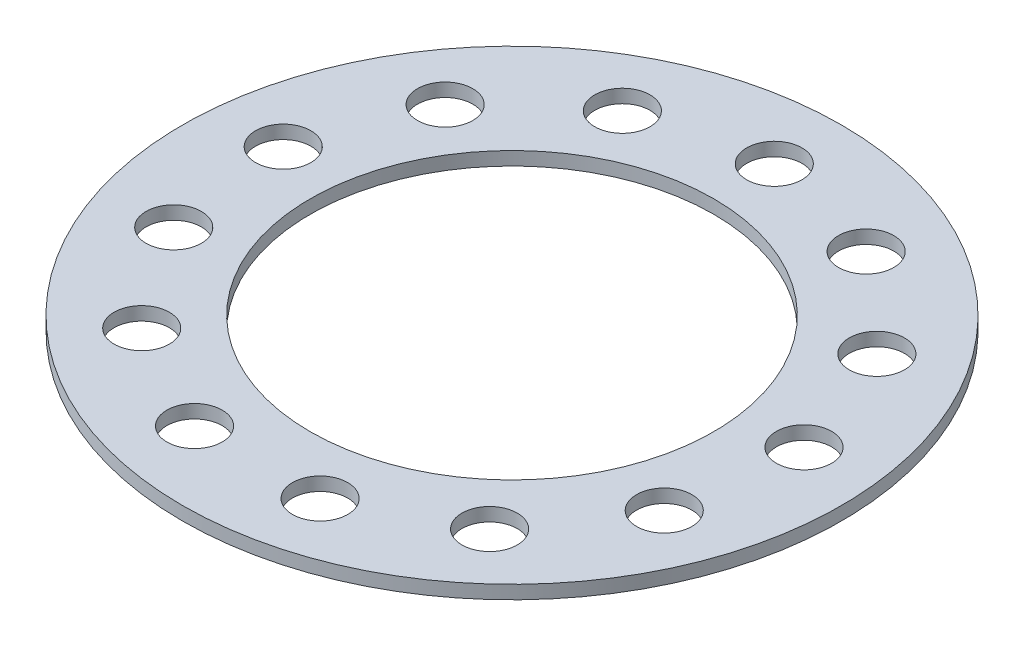
ISO-10303-21;
HEADER;
FILE_DESCRIPTION(('STEP AP214'),'2;1');
FILE_NAME('part.step','',(''),(''),'','','');
FILE_SCHEMA(('AUTOMOTIVE_DESIGN { 1 0 10303 214 1 1 1 1 }'));
ENDSEC;
DATA;
#1=APPLICATION_CONTEXT('core data for automotive mechanical design processes');
#2=APPLICATION_PROTOCOL_DEFINITION('international standard','automotive_design',2000,#1);
#3=PRODUCT_CONTEXT('',#1,'mechanical');
#4=PRODUCT('Part','Part','',(#3));
#5=PRODUCT_RELATED_PRODUCT_CATEGORY('part','',(#4));
#6=PRODUCT_DEFINITION_FORMATION('','',#4);
#7=PRODUCT_DEFINITION_CONTEXT('part definition',#1,'design');
#8=PRODUCT_DEFINITION('design','',#6,#7);
#9=PRODUCT_DEFINITION_SHAPE('','',#8);
#10=(LENGTH_UNIT() NAMED_UNIT(*) SI_UNIT(.MILLI.,.METRE.));
#11=(NAMED_UNIT(*) PLANE_ANGLE_UNIT() SI_UNIT($,.RADIAN.));
#12=(NAMED_UNIT(*) SI_UNIT($,.STERADIAN.) SOLID_ANGLE_UNIT());
#13=UNCERTAINTY_MEASURE_WITH_UNIT(LENGTH_MEASURE(1.E-05),#10,'distance_accuracy_value','');
#14=(GEOMETRIC_REPRESENTATION_CONTEXT(3) GLOBAL_UNCERTAINTY_ASSIGNED_CONTEXT((#13)) GLOBAL_UNIT_ASSIGNED_CONTEXT((#10,
#11,#12)) REPRESENTATION_CONTEXT('',''));
#15=CARTESIAN_POINT('',(0.,0.,0.));
#16=DIRECTION('',(0.,0.,1.));
#17=DIRECTION('',(1.,0.,0.));
#18=AXIS2_PLACEMENT_3D('',#15,#16,#17);
#19=CARTESIAN_POINT('',(0.,1.,0.));
#20=DIRECTION('',(0.,1.,0.));
#21=DIRECTION('',(0.,0.,1.));
#22=AXIS2_PLACEMENT_3D('',#19,#20,#21);
#23=PLANE('',#22);
#24=CARTESIAN_POINT('',(-16.0481853849263,1.,-11.0772625612575));
#25=DIRECTION('',(0.,1.,0.));
#26=DIRECTION('',(0.822983865893658,0.,0.568064746731154));
#27=AXIS2_PLACEMENT_3D('',#24,#25,#26);
#28=CIRCLE('',#27,2.055);
#29=CARTESIAN_POINT('',(-14.3569535405149,1.,-9.90988950672498));
#30=VERTEX_POINT('',#29);
#31=EDGE_CURVE('E108',#30,#30,#28,.T.);
#32=ORIENTED_EDGE('',*,*,#31,.F.);
#33=EDGE_LOOP('',(#32));
#34=FACE_BOUND('',#33,.T.);
#35=CARTESIAN_POINT('',(-19.3578230449121,1.,-2.35046526497874));
#36=DIRECTION('',(0.,1.,0.));
#37=DIRECTION('',(0.992708874098054,0.,0.12053668025532));
#38=AXIS2_PLACEMENT_3D('',#35,#36,#37);
#39=CIRCLE('',#38,2.055);
#40=CARTESIAN_POINT('',(-17.3178063086406,1.,-2.10276238705406));
#41=VERTEX_POINT('',#40);
#42=EDGE_CURVE('E102',#41,#41,#39,.T.);
#43=ORIENTED_EDGE('',*,*,#42,.F.);
#44=EDGE_LOOP('',(#43));
#45=FACE_BOUND('',#44,.T.);
#46=CARTESIAN_POINT('',(-18.2328167323656,1.,6.91479529732952));
#47=DIRECTION('',(0.,1.,0.));
#48=DIRECTION('',(0.935016242685413,0.,-0.35460488704254));
#49=AXIS2_PLACEMENT_3D('',#46,#47,#48);
#50=CIRCLE('',#49,2.055);
#51=CARTESIAN_POINT('',(-16.311358353647,1.,6.1860822544571));
#52=VERTEX_POINT('',#51);
#53=EDGE_CURVE('E96',#52,#52,#50,.T.);
#54=ORIENTED_EDGE('',*,*,#53,.F.);
#55=EDGE_LOOP('',(#54));
#56=FACE_BOUND('',#55,.T.);
#57=CARTESIAN_POINT('',(-12.9308918356954,1.,14.5959595893365));
#58=DIRECTION('',(0.,1.,0.));
#59=DIRECTION('',(0.663122658240791,0.,-0.748510748171105));
#60=AXIS2_PLACEMENT_3D('',#57,#58,#59);
#61=CIRCLE('',#60,2.055);
#62=CARTESIAN_POINT('',(-11.5681747730106,1.,13.0577700018449));
#63=VERTEX_POINT('',#62);
#64=EDGE_CURVE('E90',#63,#63,#61,.T.);
#65=ORIENTED_EDGE('',*,*,#64,.F.);
#66=EDGE_LOOP('',(#65));
#67=FACE_BOUND('',#66,.T.);
#68=CARTESIAN_POINT('',(-4.66665545360726,1.,18.933365439808));
#69=DIRECTION('',(0.,1.,0.));
#70=DIRECTION('',(0.239315664287552,0.,-0.970941817426054));
#71=AXIS2_PLACEMENT_3D('',#68,#69,#70);
#72=CIRCLE('',#71,2.055);
#73=CARTESIAN_POINT('',(-4.17486176349634,1.,16.9380800049975));
#74=VERTEX_POINT('',#73);
#75=EDGE_CURVE('E84',#74,#74,#72,.T.);
#76=ORIENTED_EDGE('',*,*,#75,.F.);
#77=EDGE_LOOP('',(#76));
#78=FACE_BOUND('',#77,.T.);
#79=CARTESIAN_POINT('',(4.66665545360752,1.,18.933365439808));
#80=DIRECTION('',(0.,1.,0.));
#81=DIRECTION('',(-0.239315664287565,0.,-0.97094181742605));
#82=AXIS2_PLACEMENT_3D('',#79,#80,#81);
#83=CIRCLE('',#82,2.055);
#84=CARTESIAN_POINT('',(4.17486176349658,1.,16.9380800049974));
#85=VERTEX_POINT('',#84);
#86=EDGE_CURVE('E78',#85,#85,#83,.T.);
#87=ORIENTED_EDGE('',*,*,#86,.F.);
#88=EDGE_LOOP('',(#87));
#89=FACE_BOUND('',#88,.T.);
#90=CARTESIAN_POINT('',(12.9308918356956,1.,14.5959595893364));
#91=DIRECTION('',(0.,1.,0.));
#92=DIRECTION('',(-0.663122658240802,0.,-0.748510748171095));
#93=AXIS2_PLACEMENT_3D('',#90,#91,#92);
#94=CIRCLE('',#93,2.055);
#95=CARTESIAN_POINT('',(11.5681747730108,1.,13.0577700018448));
#96=VERTEX_POINT('',#95);
#97=EDGE_CURVE('E72',#96,#96,#94,.T.);
#98=ORIENTED_EDGE('',*,*,#97,.F.);
#99=EDGE_LOOP('',(#98));
#100=FACE_BOUND('',#99,.T.);
#101=CARTESIAN_POINT('',(18.2328167323657,1.,6.91479529732927));
#102=DIRECTION('',(0.,1.,0.));
#103=DIRECTION('',(-0.935016242685418,0.,-0.354604887042527));
#104=AXIS2_PLACEMENT_3D('',#101,#102,#103);
#105=CIRCLE('',#104,2.055);
#106=CARTESIAN_POINT('',(16.3113583536471,1.,6.18608225445688));
#107=VERTEX_POINT('',#106);
#108=EDGE_CURVE('E65',#107,#107,#105,.T.);
#109=ORIENTED_EDGE('',*,*,#108,.F.);
#110=EDGE_LOOP('',(#109));
#111=FACE_BOUND('',#110,.T.);
#112=CARTESIAN_POINT('',(19.357823044912,1.,-2.35046526497901));
#113=DIRECTION('',(0.,1.,0.));
#114=DIRECTION('',(-0.992708874098053,0.,0.120536680255334));
#115=AXIS2_PLACEMENT_3D('',#112,#113,#114);
#116=CIRCLE('',#115,2.055);
#117=CARTESIAN_POINT('',(17.3178063086405,1.,-2.1027623870543));
#118=VERTEX_POINT('',#117);
#119=EDGE_CURVE('E125',#118,#118,#116,.T.);
#120=ORIENTED_EDGE('',*,*,#119,.F.);
#121=EDGE_LOOP('',(#120));
#122=FACE_BOUND('',#121,.T.);
#123=CARTESIAN_POINT('',(16.0481853849262,1.,-11.0772625612577));
#124=DIRECTION('',(0.,1.,0.));
#125=DIRECTION('',(-0.822983865893649,0.,0.568064746731166));
#126=AXIS2_PLACEMENT_3D('',#123,#124,#125);
#127=CIRCLE('',#126,2.055);
#128=CARTESIAN_POINT('',(14.3569535405147,1.,-9.90988950672519));
#129=VERTEX_POINT('',#128);
#130=EDGE_CURVE('E119',#129,#129,#127,.T.);
#131=ORIENTED_EDGE('',*,*,#130,.F.);
#132=EDGE_LOOP('',(#131));
#133=FACE_BOUND('',#132,.T.);
#134=CARTESIAN_POINT('',(9.06210185485327,1.,-17.2663925002377));
#135=DIRECTION('',(0.,1.,0.));
#136=DIRECTION('',(-0.464723172043757,0.,0.885456025653216));
#137=AXIS2_PLACEMENT_3D('',#134,#135,#136);
#138=CIRCLE('',#137,2.055);
#139=CARTESIAN_POINT('',(8.10709573630335,1.,-15.4467803675204));
#140=VERTEX_POINT('',#139);
#141=EDGE_CURVE('E113',#140,#140,#138,.T.);
#142=ORIENTED_EDGE('',*,*,#141,.F.);
#143=EDGE_LOOP('',(#142));
#144=FACE_BOUND('',#143,.T.);
#145=CARTESIAN_POINT('',(-9.06210185485351,1.,-17.2663925002376));
#146=DIRECTION('',(0.,1.,0.));
#147=DIRECTION('',(0.46472317204377,0.,0.885456025653209));
#148=AXIS2_PLACEMENT_3D('',#145,#146,#147);
#149=CIRCLE('',#148,2.055);
#150=CARTESIAN_POINT('',(-8.10709573630356,1.,-15.4467803675202));
#151=VERTEX_POINT('',#150);
#152=EDGE_CURVE('E59',#151,#151,#149,.T.);
#153=ORIENTED_EDGE('',*,*,#152,.F.);
#154=EDGE_LOOP('',(#153));
#155=FACE_BOUND('',#154,.T.);
#156=CARTESIAN_POINT('',(0.,1.,-19.5));
#157=DIRECTION('',(0.,1.,0.));
#158=DIRECTION('',(0.,0.,1.));
#159=AXIS2_PLACEMENT_3D('',#156,#157,#158);
#160=CIRCLE('',#159,2.055);
#161=CARTESIAN_POINT('',(0.,1.,-17.445));
#162=VERTEX_POINT('',#161);
#163=EDGE_CURVE('E53',#162,#162,#160,.T.);
#164=ORIENTED_EDGE('',*,*,#163,.F.);
#165=EDGE_LOOP('',(#164));
#166=FACE_BOUND('',#165,.T.);
#167=CARTESIAN_POINT('',(0.,1.,0.));
#168=DIRECTION('',(0.,1.,0.));
#169=DIRECTION('',(0.,0.,1.));
#170=AXIS2_PLACEMENT_3D('',#167,#168,#169);
#171=CIRCLE('',#170,24.5);
#172=CARTESIAN_POINT('',(0.,1.,24.5));
#173=VERTEX_POINT('',#172);
#174=EDGE_CURVE('E10',#173,#173,#171,.T.);
#175=ORIENTED_EDGE('',*,*,#174,.T.);
#176=EDGE_LOOP('',(#175));
#177=FACE_BOUND('',#176,.T.);
#178=CARTESIAN_POINT('',(0.,1.,0.));
#179=DIRECTION('',(0.,1.,0.));
#180=DIRECTION('',(0.,0.,1.));
#181=AXIS2_PLACEMENT_3D('',#178,#179,#180);
#182=CIRCLE('',#181,15.);
#183=CARTESIAN_POINT('',(0.,1.,15.));
#184=VERTEX_POINT('',#183);
#185=EDGE_CURVE('E45',#184,#184,#182,.T.);
#186=ORIENTED_EDGE('',*,*,#185,.F.);
#187=EDGE_LOOP('',(#186));
#188=FACE_BOUND('',#187,.T.);
#189=ADVANCED_FACE('F34',(#34,#45,#56,#67,#78,#89,#100,#111,#122,#133,#144,#155,#166,#177,#188),
#23,.T.);
#190=CARTESIAN_POINT('',(0.,0.,0.));
#191=DIRECTION('',(0.,1.,0.));
#192=DIRECTION('',(0.,0.,1.));
#193=AXIS2_PLACEMENT_3D('',#190,#191,#192);
#194=PLANE('',#193);
#195=CARTESIAN_POINT('',(-16.0481853849263,0.,-11.0772625612575));
#196=DIRECTION('',(0.,1.,0.));
#197=DIRECTION('',(0.822983865893658,0.,0.568064746731154));
#198=AXIS2_PLACEMENT_3D('',#195,#196,#197);
#199=CIRCLE('',#198,2.055);
#200=CARTESIAN_POINT('',(-14.3569535405149,0.,-9.90988950672498));
#201=VERTEX_POINT('',#200);
#202=EDGE_CURVE('E62',#201,#201,#199,.T.);
#203=ORIENTED_EDGE('',*,*,#202,.T.);
#204=EDGE_LOOP('',(#203));
#205=FACE_BOUND('',#204,.T.);
#206=CARTESIAN_POINT('',(-19.3578230449121,0.,-2.35046526497874));
#207=DIRECTION('',(0.,1.,0.));
#208=DIRECTION('',(0.992708874098054,0.,0.12053668025532));
#209=AXIS2_PLACEMENT_3D('',#206,#207,#208);
#210=CIRCLE('',#209,2.055);
#211=CARTESIAN_POINT('',(-17.3178063086406,0.,-2.10276238705406));
#212=VERTEX_POINT('',#211);
#213=EDGE_CURVE('E105',#212,#212,#210,.T.);
#214=ORIENTED_EDGE('',*,*,#213,.T.);
#215=EDGE_LOOP('',(#214));
#216=FACE_BOUND('',#215,.T.);
#217=CARTESIAN_POINT('',(-18.2328167323656,0.,6.91479529732952));
#218=DIRECTION('',(0.,1.,0.));
#219=DIRECTION('',(0.935016242685413,0.,-0.35460488704254));
#220=AXIS2_PLACEMENT_3D('',#217,#218,#219);
#221=CIRCLE('',#220,2.055);
#222=CARTESIAN_POINT('',(-16.311358353647,0.,6.1860822544571));
#223=VERTEX_POINT('',#222);
#224=EDGE_CURVE('E99',#223,#223,#221,.T.);
#225=ORIENTED_EDGE('',*,*,#224,.T.);
#226=EDGE_LOOP('',(#225));
#227=FACE_BOUND('',#226,.T.);
#228=CARTESIAN_POINT('',(-12.9308918356954,0.,14.5959595893365));
#229=DIRECTION('',(0.,1.,0.));
#230=DIRECTION('',(0.663122658240791,0.,-0.748510748171105));
#231=AXIS2_PLACEMENT_3D('',#228,#229,#230);
#232=CIRCLE('',#231,2.055);
#233=CARTESIAN_POINT('',(-11.5681747730106,0.,13.0577700018449));
#234=VERTEX_POINT('',#233);
#235=EDGE_CURVE('E93',#234,#234,#232,.T.);
#236=ORIENTED_EDGE('',*,*,#235,.T.);
#237=EDGE_LOOP('',(#236));
#238=FACE_BOUND('',#237,.T.);
#239=CARTESIAN_POINT('',(-4.66665545360726,0.,18.933365439808));
#240=DIRECTION('',(0.,1.,0.));
#241=DIRECTION('',(0.239315664287552,0.,-0.970941817426054));
#242=AXIS2_PLACEMENT_3D('',#239,#240,#241);
#243=CIRCLE('',#242,2.055);
#244=CARTESIAN_POINT('',(-4.17486176349634,0.,16.9380800049975));
#245=VERTEX_POINT('',#244);
#246=EDGE_CURVE('E87',#245,#245,#243,.T.);
#247=ORIENTED_EDGE('',*,*,#246,.T.);
#248=EDGE_LOOP('',(#247));
#249=FACE_BOUND('',#248,.T.);
#250=CARTESIAN_POINT('',(4.66665545360752,0.,18.933365439808));
#251=DIRECTION('',(0.,1.,0.));
#252=DIRECTION('',(-0.239315664287565,0.,-0.97094181742605));
#253=AXIS2_PLACEMENT_3D('',#250,#251,#252);
#254=CIRCLE('',#253,2.055);
#255=CARTESIAN_POINT('',(4.17486176349658,0.,16.9380800049974));
#256=VERTEX_POINT('',#255);
#257=EDGE_CURVE('E81',#256,#256,#254,.T.);
#258=ORIENTED_EDGE('',*,*,#257,.T.);
#259=EDGE_LOOP('',(#258));
#260=FACE_BOUND('',#259,.T.);
#261=CARTESIAN_POINT('',(12.9308918356956,0.,14.5959595893364));
#262=DIRECTION('',(0.,1.,0.));
#263=DIRECTION('',(-0.663122658240802,0.,-0.748510748171095));
#264=AXIS2_PLACEMENT_3D('',#261,#262,#263);
#265=CIRCLE('',#264,2.055);
#266=CARTESIAN_POINT('',(11.5681747730108,0.,13.0577700018448));
#267=VERTEX_POINT('',#266);
#268=EDGE_CURVE('E75',#267,#267,#265,.T.);
#269=ORIENTED_EDGE('',*,*,#268,.T.);
#270=EDGE_LOOP('',(#269));
#271=FACE_BOUND('',#270,.T.);
#272=CARTESIAN_POINT('',(18.2328167323657,0.,6.91479529732927));
#273=DIRECTION('',(0.,1.,0.));
#274=DIRECTION('',(-0.935016242685418,0.,-0.354604887042527));
#275=AXIS2_PLACEMENT_3D('',#272,#273,#274);
#276=CIRCLE('',#275,2.055);
#277=CARTESIAN_POINT('',(16.3113583536471,0.,6.18608225445688));
#278=VERTEX_POINT('',#277);
#279=EDGE_CURVE('E68',#278,#278,#276,.T.);
#280=ORIENTED_EDGE('',*,*,#279,.T.);
#281=EDGE_LOOP('',(#280));
#282=FACE_BOUND('',#281,.T.);
#283=CARTESIAN_POINT('',(19.357823044912,0.,-2.35046526497901));
#284=DIRECTION('',(0.,1.,0.));
#285=DIRECTION('',(-0.992708874098053,0.,0.120536680255334));
#286=AXIS2_PLACEMENT_3D('',#283,#284,#285);
#287=CIRCLE('',#286,2.055);
#288=CARTESIAN_POINT('',(17.3178063086405,0.,-2.1027623870543));
#289=VERTEX_POINT('',#288);
#290=EDGE_CURVE('E69',#289,#289,#287,.T.);
#291=ORIENTED_EDGE('',*,*,#290,.T.);
#292=EDGE_LOOP('',(#291));
#293=FACE_BOUND('',#292,.T.);
#294=CARTESIAN_POINT('',(16.0481853849262,0.,-11.0772625612577));
#295=DIRECTION('',(0.,1.,0.));
#296=DIRECTION('',(-0.822983865893649,0.,0.568064746731166));
#297=AXIS2_PLACEMENT_3D('',#294,#295,#296);
#298=CIRCLE('',#297,2.055);
#299=CARTESIAN_POINT('',(14.3569535405147,0.,-9.90988950672519));
#300=VERTEX_POINT('',#299);
#301=EDGE_CURVE('E122',#300,#300,#298,.T.);
#302=ORIENTED_EDGE('',*,*,#301,.T.);
#303=EDGE_LOOP('',(#302));
#304=FACE_BOUND('',#303,.T.);
#305=CARTESIAN_POINT('',(9.06210185485327,0.,-17.2663925002377));
#306=DIRECTION('',(0.,1.,0.));
#307=DIRECTION('',(-0.464723172043757,0.,0.885456025653216));
#308=AXIS2_PLACEMENT_3D('',#305,#306,#307);
#309=CIRCLE('',#308,2.055);
#310=CARTESIAN_POINT('',(8.10709573630335,0.,-15.4467803675204));
#311=VERTEX_POINT('',#310);
#312=EDGE_CURVE('E116',#311,#311,#309,.T.);
#313=ORIENTED_EDGE('',*,*,#312,.T.);
#314=EDGE_LOOP('',(#313));
#315=FACE_BOUND('',#314,.T.);
#316=CARTESIAN_POINT('',(-9.06210185485351,0.,-17.2663925002376));
#317=DIRECTION('',(0.,1.,0.));
#318=DIRECTION('',(0.46472317204377,0.,0.885456025653209));
#319=AXIS2_PLACEMENT_3D('',#316,#317,#318);
#320=CIRCLE('',#319,2.055);
#321=CARTESIAN_POINT('',(-8.10709573630356,0.,-15.4467803675202));
#322=VERTEX_POINT('',#321);
#323=EDGE_CURVE('E56',#322,#322,#320,.T.);
#324=ORIENTED_EDGE('',*,*,#323,.T.);
#325=EDGE_LOOP('',(#324));
#326=FACE_BOUND('',#325,.T.);
#327=CARTESIAN_POINT('',(0.,0.,-19.5));
#328=DIRECTION('',(0.,1.,0.));
#329=DIRECTION('',(0.,0.,1.));
#330=AXIS2_PLACEMENT_3D('',#327,#328,#329);
#331=CIRCLE('',#330,2.055);
#332=CARTESIAN_POINT('',(0.,0.,-17.445));
#333=VERTEX_POINT('',#332);
#334=EDGE_CURVE('E50',#333,#333,#331,.T.);
#335=ORIENTED_EDGE('',*,*,#334,.T.);
#336=EDGE_LOOP('',(#335));
#337=FACE_BOUND('',#336,.T.);
#338=CARTESIAN_POINT('',(0.,0.,0.));
#339=DIRECTION('',(0.,1.,0.));
#340=DIRECTION('',(0.,0.,1.));
#341=AXIS2_PLACEMENT_3D('',#338,#339,#340);
#342=CIRCLE('',#341,24.5);
#343=CARTESIAN_POINT('',(0.,0.,24.5));
#344=VERTEX_POINT('',#343);
#345=EDGE_CURVE('E38',#344,#344,#342,.T.);
#346=ORIENTED_EDGE('',*,*,#345,.F.);
#347=EDGE_LOOP('',(#346));
#348=FACE_BOUND('',#347,.T.);
#349=CARTESIAN_POINT('',(0.,0.,0.));
#350=DIRECTION('',(0.,1.,0.));
#351=DIRECTION('',(0.,0.,1.));
#352=AXIS2_PLACEMENT_3D('',#349,#350,#351);
#353=CIRCLE('',#352,15.);
#354=CARTESIAN_POINT('',(0.,0.,15.));
#355=VERTEX_POINT('',#354);
#356=EDGE_CURVE('E47',#355,#355,#353,.T.);
#357=ORIENTED_EDGE('',*,*,#356,.T.);
#358=EDGE_LOOP('',(#357));
#359=FACE_BOUND('',#358,.T.);
#360=ADVANCED_FACE('F131',(#205,#216,#227,#238,#249,#260,#271,#282,#293,#304,#315,#326,#337,
#348,#359),#194,.F.);
#361=CARTESIAN_POINT('',(0.,1.,0.));
#362=DIRECTION('',(0.,-1.,0.));
#363=DIRECTION('',(0.,0.,-1.));
#364=AXIS2_PLACEMENT_3D('',#361,#362,#363);
#365=CYLINDRICAL_SURFACE('',#364,24.5);
#366=ORIENTED_EDGE('',*,*,#174,.F.);
#367=EDGE_LOOP('',(#366));
#368=FACE_BOUND('',#367,.T.);
#369=ORIENTED_EDGE('',*,*,#345,.T.);
#370=EDGE_LOOP('',(#369));
#371=FACE_BOUND('',#370,.T.);
#372=ADVANCED_FACE('F36',(#368,#371),#365,.T.);
#373=CARTESIAN_POINT('',(0.,1.,0.));
#374=DIRECTION('',(0.,-1.,0.));
#375=DIRECTION('',(0.,0.,-1.));
#376=AXIS2_PLACEMENT_3D('',#373,#374,#375);
#377=CYLINDRICAL_SURFACE('',#376,15.);
#378=ORIENTED_EDGE('',*,*,#185,.T.);
#379=EDGE_LOOP('',(#378));
#380=FACE_BOUND('',#379,.T.);
#381=ORIENTED_EDGE('',*,*,#356,.F.);
#382=EDGE_LOOP('',(#381));
#383=FACE_BOUND('',#382,.T.);
#384=ADVANCED_FACE('F156',(#380,#383),#377,.F.);
#385=CARTESIAN_POINT('',(0.,0.,-19.5));
#386=DIRECTION('',(0.,1.,0.));
#387=DIRECTION('',(0.,0.,1.));
#388=AXIS2_PLACEMENT_3D('',#385,#386,#387);
#389=CYLINDRICAL_SURFACE('',#388,2.055);
#390=ORIENTED_EDGE('',*,*,#334,.F.);
#391=EDGE_LOOP('',(#390));
#392=FACE_BOUND('',#391,.T.);
#393=ORIENTED_EDGE('',*,*,#163,.T.);
#394=EDGE_LOOP('',(#393));
#395=FACE_BOUND('',#394,.T.);
#396=ADVANCED_FACE('F159',(#392,#395),#389,.F.);
#397=CARTESIAN_POINT('',(-9.06210185485351,0.,-17.2663925002376));
#398=DIRECTION('',(0.,1.,0.));
#399=DIRECTION('',(0.,0.,1.));
#400=AXIS2_PLACEMENT_3D('',#397,#398,#399);
#401=CYLINDRICAL_SURFACE('',#400,2.055);
#402=ORIENTED_EDGE('',*,*,#323,.F.);
#403=EDGE_LOOP('',(#402));
#404=FACE_BOUND('',#403,.T.);
#405=ORIENTED_EDGE('',*,*,#152,.T.);
#406=EDGE_LOOP('',(#405));
#407=FACE_BOUND('',#406,.T.);
#408=ADVANCED_FACE('F173',(#404,#407),#401,.F.);
#409=CARTESIAN_POINT('',(9.06210185485327,0.,-17.2663925002377));
#410=DIRECTION('',(0.,1.,0.));
#411=DIRECTION('',(0.,0.,1.));
#412=AXIS2_PLACEMENT_3D('',#409,#410,#411);
#413=CYLINDRICAL_SURFACE('',#412,2.055);
#414=ORIENTED_EDGE('',*,*,#312,.F.);
#415=EDGE_LOOP('',(#414));
#416=FACE_BOUND('',#415,.T.);
#417=ORIENTED_EDGE('',*,*,#141,.T.);
#418=EDGE_LOOP('',(#417));
#419=FACE_BOUND('',#418,.T.);
#420=ADVANCED_FACE('F177',(#416,#419),#413,.F.);
#421=CARTESIAN_POINT('',(16.0481853849262,0.,-11.0772625612577));
#422=DIRECTION('',(0.,1.,0.));
#423=DIRECTION('',(0.,0.,1.));
#424=AXIS2_PLACEMENT_3D('',#421,#422,#423);
#425=CYLINDRICAL_SURFACE('',#424,2.055);
#426=ORIENTED_EDGE('',*,*,#301,.F.);
#427=EDGE_LOOP('',(#426));
#428=FACE_BOUND('',#427,.T.);
#429=ORIENTED_EDGE('',*,*,#130,.T.);
#430=EDGE_LOOP('',(#429));
#431=FACE_BOUND('',#430,.T.);
#432=ADVANCED_FACE('F138',(#428,#431),#425,.F.);
#433=CARTESIAN_POINT('',(19.357823044912,0.,-2.35046526497901));
#434=DIRECTION('',(0.,1.,0.));
#435=DIRECTION('',(0.,0.,1.));
#436=AXIS2_PLACEMENT_3D('',#433,#434,#435);
#437=CYLINDRICAL_SURFACE('',#436,2.055);
#438=ORIENTED_EDGE('',*,*,#290,.F.);
#439=EDGE_LOOP('',(#438));
#440=FACE_BOUND('',#439,.T.);
#441=ORIENTED_EDGE('',*,*,#119,.T.);
#442=EDGE_LOOP('',(#441));
#443=FACE_BOUND('',#442,.T.);
#444=ADVANCED_FACE('F134',(#440,#443),#437,.F.);
#445=CARTESIAN_POINT('',(18.2328167323657,0.,6.91479529732927));
#446=DIRECTION('',(0.,1.,0.));
#447=DIRECTION('',(0.,0.,1.));
#448=AXIS2_PLACEMENT_3D('',#445,#446,#447);
#449=CYLINDRICAL_SURFACE('',#448,2.055);
#450=ORIENTED_EDGE('',*,*,#279,.F.);
#451=EDGE_LOOP('',(#450));
#452=FACE_BOUND('',#451,.T.);
#453=ORIENTED_EDGE('',*,*,#108,.T.);
#454=EDGE_LOOP('',(#453));
#455=FACE_BOUND('',#454,.T.);
#456=ADVANCED_FACE('F137',(#452,#455),#449,.F.);
#457=CARTESIAN_POINT('',(12.9308918356956,0.,14.5959595893364));
#458=DIRECTION('',(0.,1.,0.));
#459=DIRECTION('',(0.,0.,1.));
#460=AXIS2_PLACEMENT_3D('',#457,#458,#459);
#461=CYLINDRICAL_SURFACE('',#460,2.055);
#462=ORIENTED_EDGE('',*,*,#268,.F.);
#463=EDGE_LOOP('',(#462));
#464=FACE_BOUND('',#463,.T.);
#465=ORIENTED_EDGE('',*,*,#97,.T.);
#466=EDGE_LOOP('',(#465));
#467=FACE_BOUND('',#466,.T.);
#468=ADVANCED_FACE('F181',(#464,#467),#461,.F.);
#469=CARTESIAN_POINT('',(4.66665545360752,0.,18.933365439808));
#470=DIRECTION('',(0.,1.,0.));
#471=DIRECTION('',(0.,0.,1.));
#472=AXIS2_PLACEMENT_3D('',#469,#470,#471);
#473=CYLINDRICAL_SURFACE('',#472,2.055);
#474=ORIENTED_EDGE('',*,*,#257,.F.);
#475=EDGE_LOOP('',(#474));
#476=FACE_BOUND('',#475,.T.);
#477=ORIENTED_EDGE('',*,*,#86,.T.);
#478=EDGE_LOOP('',(#477));
#479=FACE_BOUND('',#478,.T.);
#480=ADVANCED_FACE('F185',(#476,#479),#473,.F.);
#481=CARTESIAN_POINT('',(-4.66665545360726,0.,18.933365439808));
#482=DIRECTION('',(0.,1.,0.));
#483=DIRECTION('',(0.,0.,1.));
#484=AXIS2_PLACEMENT_3D('',#481,#482,#483);
#485=CYLINDRICAL_SURFACE('',#484,2.055);
#486=ORIENTED_EDGE('',*,*,#246,.F.);
#487=EDGE_LOOP('',(#486));
#488=FACE_BOUND('',#487,.T.);
#489=ORIENTED_EDGE('',*,*,#75,.T.);
#490=EDGE_LOOP('',(#489));
#491=FACE_BOUND('',#490,.T.);
#492=ADVANCED_FACE('F189',(#488,#491),#485,.F.);
#493=CARTESIAN_POINT('',(-12.9308918356954,0.,14.5959595893365));
#494=DIRECTION('',(0.,1.,0.));
#495=DIRECTION('',(0.,0.,1.));
#496=AXIS2_PLACEMENT_3D('',#493,#494,#495);
#497=CYLINDRICAL_SURFACE('',#496,2.055);
#498=ORIENTED_EDGE('',*,*,#235,.F.);
#499=EDGE_LOOP('',(#498));
#500=FACE_BOUND('',#499,.T.);
#501=ORIENTED_EDGE('',*,*,#64,.T.);
#502=EDGE_LOOP('',(#501));
#503=FACE_BOUND('',#502,.T.);
#504=ADVANCED_FACE('F193',(#500,#503),#497,.F.);
#505=CARTESIAN_POINT('',(-18.2328167323656,0.,6.91479529732952));
#506=DIRECTION('',(0.,1.,0.));
#507=DIRECTION('',(0.,0.,1.));
#508=AXIS2_PLACEMENT_3D('',#505,#506,#507);
#509=CYLINDRICAL_SURFACE('',#508,2.055);
#510=ORIENTED_EDGE('',*,*,#224,.F.);
#511=EDGE_LOOP('',(#510));
#512=FACE_BOUND('',#511,.T.);
#513=ORIENTED_EDGE('',*,*,#53,.T.);
#514=EDGE_LOOP('',(#513));
#515=FACE_BOUND('',#514,.T.);
#516=ADVANCED_FACE('F197',(#512,#515),#509,.F.);
#517=CARTESIAN_POINT('',(-19.3578230449121,0.,-2.35046526497874));
#518=DIRECTION('',(0.,1.,0.));
#519=DIRECTION('',(0.,0.,1.));
#520=AXIS2_PLACEMENT_3D('',#517,#518,#519);
#521=CYLINDRICAL_SURFACE('',#520,2.055);
#522=ORIENTED_EDGE('',*,*,#213,.F.);
#523=EDGE_LOOP('',(#522));
#524=FACE_BOUND('',#523,.T.);
#525=ORIENTED_EDGE('',*,*,#42,.T.);
#526=EDGE_LOOP('',(#525));
#527=FACE_BOUND('',#526,.T.);
#528=ADVANCED_FACE('F201',(#524,#527),#521,.F.);
#529=CARTESIAN_POINT('',(-16.0481853849263,0.,-11.0772625612575));
#530=DIRECTION('',(0.,1.,0.));
#531=DIRECTION('',(0.,0.,1.));
#532=AXIS2_PLACEMENT_3D('',#529,#530,#531);
#533=CYLINDRICAL_SURFACE('',#532,2.055);
#534=ORIENTED_EDGE('',*,*,#202,.F.);
#535=EDGE_LOOP('',(#534));
#536=FACE_BOUND('',#535,.T.);
#537=ORIENTED_EDGE('',*,*,#31,.T.);
#538=EDGE_LOOP('',(#537));
#539=FACE_BOUND('',#538,.T.);
#540=ADVANCED_FACE('F205',(#536,#539),#533,.F.);
#541=CLOSED_SHELL('',(#189,#360,#372,#384,#396,#408,#420,#432,#444,#456,#468,#480,#492,#504,
#516,#528,#540));
#542=MANIFOLD_SOLID_BREP('B2',#541);
#543=ADVANCED_BREP_SHAPE_REPRESENTATION('',(#18,#542),#14);
#544=SHAPE_DEFINITION_REPRESENTATION(#9,#543);
ENDSEC;
END-ISO-10303-21;
